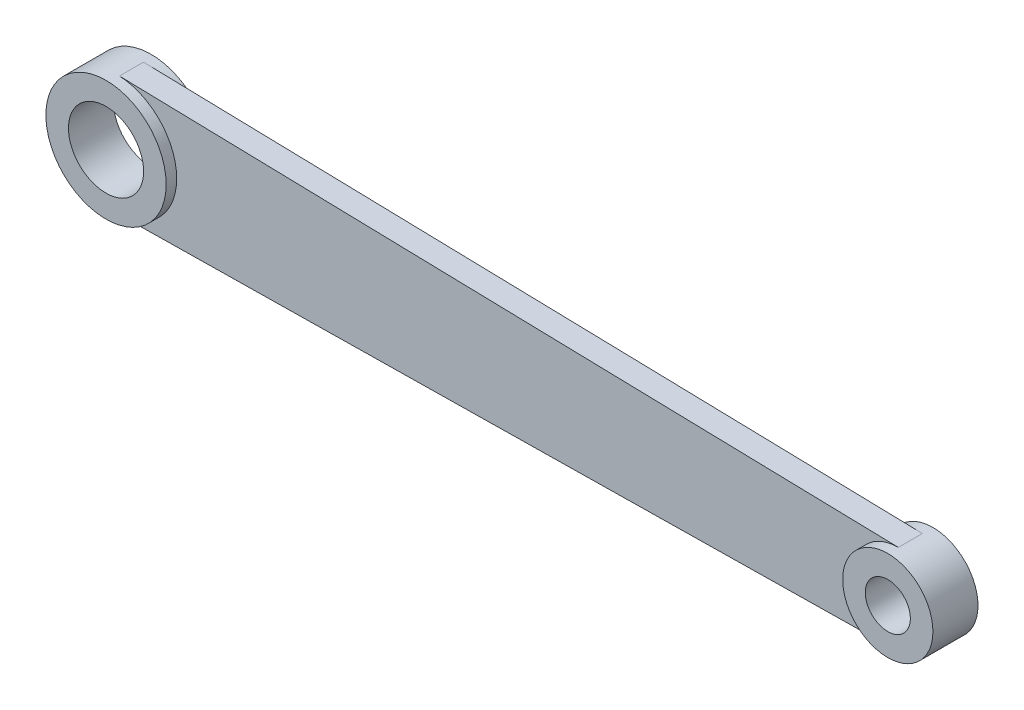
ISO-10303-21;
HEADER;
FILE_DESCRIPTION(('STEP AP214'),'2;1');
FILE_NAME('part.step','',(''),(''),'','','');
FILE_SCHEMA(('AUTOMOTIVE_DESIGN { 1 0 10303 214 1 1 1 1 }'));
ENDSEC;
DATA;
#1=APPLICATION_CONTEXT('core data for automotive mechanical design processes');
#2=APPLICATION_PROTOCOL_DEFINITION('international standard','automotive_design',2000,#1);
#3=PRODUCT_CONTEXT('',#1,'mechanical');
#4=PRODUCT('Part','Part','',(#3));
#5=PRODUCT_RELATED_PRODUCT_CATEGORY('part','',(#4));
#6=PRODUCT_DEFINITION_FORMATION('','',#4);
#7=PRODUCT_DEFINITION_CONTEXT('part definition',#1,'design');
#8=PRODUCT_DEFINITION('design','',#6,#7);
#9=PRODUCT_DEFINITION_SHAPE('','',#8);
#10=(LENGTH_UNIT() NAMED_UNIT(*) SI_UNIT(.MILLI.,.METRE.));
#11=(NAMED_UNIT(*) PLANE_ANGLE_UNIT() SI_UNIT($,.RADIAN.));
#12=(NAMED_UNIT(*) SI_UNIT($,.STERADIAN.) SOLID_ANGLE_UNIT());
#13=UNCERTAINTY_MEASURE_WITH_UNIT(LENGTH_MEASURE(1.E-05),#10,'distance_accuracy_value','');
#14=(GEOMETRIC_REPRESENTATION_CONTEXT(3) GLOBAL_UNCERTAINTY_ASSIGNED_CONTEXT((#13)) GLOBAL_UNIT_ASSIGNED_CONTEXT((#10,
#11,#12)) REPRESENTATION_CONTEXT('',''));
#15=CARTESIAN_POINT('',(0.,0.,0.));
#16=DIRECTION('',(0.,0.,1.));
#17=DIRECTION('',(1.,0.,0.));
#18=AXIS2_PLACEMENT_3D('',#15,#16,#17);
#19=CARTESIAN_POINT('',(0.365782486916927,15.1615884199877,4.));
#20=DIRECTION('',(0.0241185865450105,0.999709104581463,0.));
#21=DIRECTION('',(-0.999709104581463,0.0241185865450105,0.));
#22=AXIS2_PLACEMENT_3D('',#19,#20,#21);
#23=PLANE('',#22);
#24=DIRECTION('',(0.999709104581463,-0.0241185865450105,0.));
#25=VECTOR('',#24,1.);
#26=CARTESIAN_POINT('',(0.365782486916927,15.1615884199877,-4.));
#27=LINE('',#26,#25);
#28=CARTESIAN_POINT('',(-199.220649297423,19.9767317513228,-4.));
#29=VERTEX_POINT('',#28);
#30=CARTESIAN_POINT('',(59.8148878802298,13.7273428110589,-4.));
#31=VERTEX_POINT('',#30);
#32=EDGE_CURVE('E80',#29,#31,#27,.T.);
#33=ORIENTED_EDGE('',*,*,#32,.F.);
#34=DIRECTION('',(0.,0.,-1.));
#35=VECTOR('',#34,1.);
#36=CARTESIAN_POINT('',(-199.220649297423,19.9767317513228,4.));
#37=LINE('',#36,#35);
#38=CARTESIAN_POINT('',(-199.220649297423,19.9767317513228,4.));
#39=VERTEX_POINT('',#38);
#40=EDGE_CURVE('E43',#39,#29,#37,.T.);
#41=ORIENTED_EDGE('',*,*,#40,.F.);
#42=DIRECTION('',(0.999709104581463,-0.0241185865450105,0.));
#43=VECTOR('',#42,1.);
#44=CARTESIAN_POINT('',(0.365782486916927,15.1615884199877,4.));
#45=LINE('',#44,#43);
#46=CARTESIAN_POINT('',(59.8148878802297,13.7273428110589,4.));
#47=VERTEX_POINT('',#46);
#48=EDGE_CURVE('E87',#39,#47,#45,.T.);
#49=ORIENTED_EDGE('',*,*,#48,.T.);
#50=DIRECTION('',(0.,0.,-1.));
#51=VECTOR('',#50,1.);
#52=CARTESIAN_POINT('',(59.8148878802298,13.7273428110589,4.));
#53=LINE('',#52,#51);
#54=EDGE_CURVE('E11',#47,#31,#53,.T.);
#55=ORIENTED_EDGE('',*,*,#54,.T.);
#56=EDGE_LOOP('',(#33,#41,#49,#55));
#57=FACE_BOUND('',#56,.T.);
#58=ADVANCED_FACE('F36',(#57),#23,.T.);
#59=CARTESIAN_POINT('',(0.245526373288944,-17.1266396172959,4.));
#60=DIRECTION('',(-0.0143344609623184,0.99989725633633,0.));
#61=DIRECTION('',(-0.99989725633633,-0.0143344609623184,0.));
#62=AXIS2_PLACEMENT_3D('',#59,#60,#61);
#63=PLANE('',#62);
#64=DIRECTION('',(0.99989725633633,0.0143344609623184,0.));
#65=VECTOR('',#64,1.);
#66=CARTESIAN_POINT('',(0.245526373288944,-17.1266396172959,-4.));
#67=LINE('',#66,#65);
#68=CARTESIAN_POINT('',(-199.61179259228,-19.9917809291568,-4.));
#69=VERTEX_POINT('',#68);
#70=CARTESIAN_POINT('',(59.8148878802298,-16.2726571889411,-4.));
#71=VERTEX_POINT('',#70);
#72=EDGE_CURVE('E91',#69,#71,#67,.T.);
#73=ORIENTED_EDGE('',*,*,#72,.T.);
#74=DIRECTION('',(0.,0.,-1.));
#75=VECTOR('',#74,1.);
#76=CARTESIAN_POINT('',(59.8148878802298,-16.2726571889411,4.));
#77=LINE('',#76,#75);
#78=CARTESIAN_POINT('',(59.8148878802295,-16.2726571889411,4.));
#79=VERTEX_POINT('',#78);
#80=EDGE_CURVE('E50',#79,#71,#77,.T.);
#81=ORIENTED_EDGE('',*,*,#80,.F.);
#82=DIRECTION('',(0.99989725633633,0.0143344609623184,0.));
#83=VECTOR('',#82,1.);
#84=CARTESIAN_POINT('',(0.245526373288944,-17.1266396172959,4.));
#85=LINE('',#84,#83);
#86=CARTESIAN_POINT('',(-199.611792592279,-19.9917809291568,4.));
#87=VERTEX_POINT('',#86);
#88=EDGE_CURVE('E99',#87,#79,#85,.T.);
#89=ORIENTED_EDGE('',*,*,#88,.F.);
#90=DIRECTION('',(0.,0.,-1.));
#91=VECTOR('',#90,1.);
#92=CARTESIAN_POINT('',(-199.61179259228,-19.9917809291568,4.));
#93=LINE('',#92,#91);
#94=EDGE_CURVE('E98',#87,#69,#93,.T.);
#95=ORIENTED_EDGE('',*,*,#94,.T.);
#96=EDGE_LOOP('',(#73,#81,#89,#95));
#97=FACE_BOUND('',#96,.T.);
#98=ADVANCED_FACE('F103',(#97),#63,.F.);
#99=CARTESIAN_POINT('',(0.,0.,4.));
#100=DIRECTION('',(0.,0.,1.));
#101=DIRECTION('',(1.,0.,0.));
#102=AXIS2_PLACEMENT_3D('',#99,#100,#101);
#103=PLANE('',#102);
#104=CARTESIAN_POINT('',(59.8148878802298,-1.27265718894106,4.));
#105=DIRECTION('',(0.,0.,1.));
#106=DIRECTION('',(1.,0.,0.));
#107=AXIS2_PLACEMENT_3D('',#104,#105,#106);
#108=CIRCLE('',#107,15.);
#109=EDGE_CURVE('E96',#47,#79,#108,.T.);
#110=ORIENTED_EDGE('',*,*,#109,.F.);
#111=ORIENTED_EDGE('',*,*,#48,.F.);
#112=CARTESIAN_POINT('',(-200.18511211977,0.,4.));
#113=DIRECTION('',(0.,0.,1.));
#114=DIRECTION('',(1.,0.,0.));
#115=AXIS2_PLACEMENT_3D('',#112,#113,#114);
#116=CIRCLE('',#115,20.);
#117=EDGE_CURVE('E108',#87,#39,#116,.T.);
#118=ORIENTED_EDGE('',*,*,#117,.F.);
#119=ORIENTED_EDGE('',*,*,#88,.T.);
#120=EDGE_LOOP('',(#110,#111,#118,#119));
#121=FACE_BOUND('',#120,.T.);
#122=ADVANCED_FACE('F111',(#121),#103,.T.);
#123=CARTESIAN_POINT('',(0.,0.,-4.));
#124=DIRECTION('',(0.,0.,1.));
#125=DIRECTION('',(1.,0.,0.));
#126=AXIS2_PLACEMENT_3D('',#123,#124,#125);
#127=PLANE('',#126);
#128=CARTESIAN_POINT('',(59.8148878802298,-1.27265718894106,-4.));
#129=DIRECTION('',(0.,0.,1.));
#130=DIRECTION('',(1.,0.,0.));
#131=AXIS2_PLACEMENT_3D('',#128,#129,#130);
#132=CIRCLE('',#131,15.);
#133=EDGE_CURVE('E73',#31,#71,#132,.T.);
#134=ORIENTED_EDGE('',*,*,#133,.T.);
#135=ORIENTED_EDGE('',*,*,#72,.F.);
#136=CARTESIAN_POINT('',(-200.18511211977,0.,-4.));
#137=DIRECTION('',(0.,0.,1.));
#138=DIRECTION('',(1.,0.,0.));
#139=AXIS2_PLACEMENT_3D('',#136,#137,#138);
#140=CIRCLE('',#139,20.);
#141=EDGE_CURVE('E89',#69,#29,#140,.T.);
#142=ORIENTED_EDGE('',*,*,#141,.T.);
#143=ORIENTED_EDGE('',*,*,#32,.T.);
#144=EDGE_LOOP('',(#134,#135,#142,#143));
#145=FACE_BOUND('',#144,.T.);
#146=ADVANCED_FACE('F88',(#145),#127,.F.);
#147=CARTESIAN_POINT('',(-200.18511211977,0.,7.5));
#148=DIRECTION('',(0.,0.,1.));
#149=DIRECTION('',(1.,0.,0.));
#150=AXIS2_PLACEMENT_3D('',#147,#148,#149);
#151=PLANE('',#150);
#152=CARTESIAN_POINT('',(-200.18511211977,0.,7.5));
#153=DIRECTION('',(0.,0.,1.));
#154=DIRECTION('',(1.,0.,0.));
#155=AXIS2_PLACEMENT_3D('',#152,#153,#154);
#156=CIRCLE('',#155,20.);
#157=CARTESIAN_POINT('',(-180.18511211977,0.,7.5));
#158=VERTEX_POINT('',#157);
#159=EDGE_CURVE('E81',#158,#158,#156,.T.);
#160=ORIENTED_EDGE('',*,*,#159,.T.);
#161=EDGE_LOOP('',(#160));
#162=FACE_BOUND('',#161,.T.);
#163=CARTESIAN_POINT('',(-200.18511211977,0.,7.5));
#164=DIRECTION('',(0.,0.,1.));
#165=DIRECTION('',(1.,0.,0.));
#166=AXIS2_PLACEMENT_3D('',#163,#164,#165);
#167=CIRCLE('',#166,12.5);
#168=CARTESIAN_POINT('',(-187.68511211977,0.,7.5));
#169=VERTEX_POINT('',#168);
#170=EDGE_CURVE('E118',#169,#169,#167,.T.);
#171=ORIENTED_EDGE('',*,*,#170,.F.);
#172=EDGE_LOOP('',(#171));
#173=FACE_BOUND('',#172,.T.);
#174=ADVANCED_FACE('F167',(#162,#173),#151,.T.);
#175=CARTESIAN_POINT('',(-200.18511211977,0.,-7.5));
#176=DIRECTION('',(0.,0.,1.));
#177=DIRECTION('',(1.,0.,0.));
#178=AXIS2_PLACEMENT_3D('',#175,#176,#177);
#179=PLANE('',#178);
#180=CARTESIAN_POINT('',(-200.18511211977,0.,-7.5));
#181=DIRECTION('',(0.,0.,1.));
#182=DIRECTION('',(1.,0.,0.));
#183=AXIS2_PLACEMENT_3D('',#180,#181,#182);
#184=CIRCLE('',#183,20.);
#185=CARTESIAN_POINT('',(-180.18511211977,0.,-7.5));
#186=VERTEX_POINT('',#185);
#187=EDGE_CURVE('E115',#186,#186,#184,.T.);
#188=ORIENTED_EDGE('',*,*,#187,.F.);
#189=EDGE_LOOP('',(#188));
#190=FACE_BOUND('',#189,.T.);
#191=CARTESIAN_POINT('',(-200.18511211977,0.,-7.5));
#192=DIRECTION('',(0.,0.,1.));
#193=DIRECTION('',(1.,0.,0.));
#194=AXIS2_PLACEMENT_3D('',#191,#192,#193);
#195=CIRCLE('',#194,12.5);
#196=CARTESIAN_POINT('',(-187.68511211977,0.,-7.5));
#197=VERTEX_POINT('',#196);
#198=EDGE_CURVE('E121',#197,#197,#195,.T.);
#199=ORIENTED_EDGE('',*,*,#198,.T.);
#200=EDGE_LOOP('',(#199));
#201=FACE_BOUND('',#200,.T.);
#202=ADVANCED_FACE('F171',(#190,#201),#179,.F.);
#203=CARTESIAN_POINT('',(-200.18511211977,0.,7.5));
#204=DIRECTION('',(0.,0.,-1.));
#205=DIRECTION('',(-1.,0.,0.));
#206=AXIS2_PLACEMENT_3D('',#203,#204,#205);
#207=CYLINDRICAL_SURFACE('',#206,20.);
#208=ORIENTED_EDGE('',*,*,#117,.T.);
#209=ORIENTED_EDGE('',*,*,#40,.T.);
#210=ORIENTED_EDGE('',*,*,#141,.F.);
#211=ORIENTED_EDGE('',*,*,#94,.F.);
#212=EDGE_LOOP('',(#208,#209,#210,#211));
#213=FACE_BOUND('',#212,.T.);
#214=ORIENTED_EDGE('',*,*,#159,.F.);
#215=EDGE_LOOP('',(#214));
#216=FACE_BOUND('',#215,.T.);
#217=ORIENTED_EDGE('',*,*,#187,.T.);
#218=EDGE_LOOP('',(#217));
#219=FACE_BOUND('',#218,.T.);
#220=ADVANCED_FACE('F106',(#213,#216,#219),#207,.T.);
#221=CARTESIAN_POINT('',(-200.18511211977,0.,7.5));
#222=DIRECTION('',(0.,0.,-1.));
#223=DIRECTION('',(-1.,0.,0.));
#224=AXIS2_PLACEMENT_3D('',#221,#222,#223);
#225=CYLINDRICAL_SURFACE('',#224,12.5);
#226=ORIENTED_EDGE('',*,*,#170,.T.);
#227=EDGE_LOOP('',(#226));
#228=FACE_BOUND('',#227,.T.);
#229=ORIENTED_EDGE('',*,*,#198,.F.);
#230=EDGE_LOOP('',(#229));
#231=FACE_BOUND('',#230,.T.);
#232=ADVANCED_FACE('F145',(#228,#231),#225,.F.);
#233=CARTESIAN_POINT('',(59.8148878802298,-1.27265718894106,7.5));
#234=DIRECTION('',(0.,0.,1.));
#235=DIRECTION('',(1.,0.,0.));
#236=AXIS2_PLACEMENT_3D('',#233,#234,#235);
#237=PLANE('',#236);
#238=CARTESIAN_POINT('',(59.8148878802298,-1.27265718894106,7.5));
#239=DIRECTION('',(0.,0.,1.));
#240=DIRECTION('',(1.,0.,0.));
#241=AXIS2_PLACEMENT_3D('',#238,#239,#240);
#242=CIRCLE('',#241,15.);
#243=CARTESIAN_POINT('',(74.8148878802298,-1.27265718894106,7.5));
#244=VERTEX_POINT('',#243);
#245=EDGE_CURVE('E124',#244,#244,#242,.T.);
#246=ORIENTED_EDGE('',*,*,#245,.T.);
#247=EDGE_LOOP('',(#246));
#248=FACE_BOUND('',#247,.T.);
#249=CARTESIAN_POINT('',(59.8148878802298,-1.27265718894106,7.5));
#250=DIRECTION('',(0.,0.,1.));
#251=DIRECTION('',(1.,0.,0.));
#252=AXIS2_PLACEMENT_3D('',#249,#250,#251);
#253=CIRCLE('',#252,7.50000000000001);
#254=CARTESIAN_POINT('',(67.3148878802298,-1.27265718894106,7.5));
#255=VERTEX_POINT('',#254);
#256=EDGE_CURVE('E130',#255,#255,#253,.T.);
#257=ORIENTED_EDGE('',*,*,#256,.F.);
#258=EDGE_LOOP('',(#257));
#259=FACE_BOUND('',#258,.T.);
#260=ADVANCED_FACE('F142',(#248,#259),#237,.T.);
#261=CARTESIAN_POINT('',(59.8148878802298,-1.27265718894106,-7.5));
#262=DIRECTION('',(0.,0.,1.));
#263=DIRECTION('',(1.,0.,0.));
#264=AXIS2_PLACEMENT_3D('',#261,#262,#263);
#265=PLANE('',#264);
#266=CARTESIAN_POINT('',(59.8148878802298,-1.27265718894106,-7.5));
#267=DIRECTION('',(0.,0.,1.));
#268=DIRECTION('',(1.,0.,0.));
#269=AXIS2_PLACEMENT_3D('',#266,#267,#268);
#270=CIRCLE('',#269,15.);
#271=CARTESIAN_POINT('',(74.8148878802298,-1.27265718894106,-7.5));
#272=VERTEX_POINT('',#271);
#273=EDGE_CURVE('E127',#272,#272,#270,.T.);
#274=ORIENTED_EDGE('',*,*,#273,.F.);
#275=EDGE_LOOP('',(#274));
#276=FACE_BOUND('',#275,.T.);
#277=CARTESIAN_POINT('',(59.8148878802298,-1.27265718894106,-7.5));
#278=DIRECTION('',(0.,0.,1.));
#279=DIRECTION('',(1.,0.,0.));
#280=AXIS2_PLACEMENT_3D('',#277,#278,#279);
#281=CIRCLE('',#280,7.50000000000001);
#282=CARTESIAN_POINT('',(67.3148878802298,-1.27265718894106,-7.5));
#283=VERTEX_POINT('',#282);
#284=EDGE_CURVE('E133',#283,#283,#281,.T.);
#285=ORIENTED_EDGE('',*,*,#284,.T.);
#286=EDGE_LOOP('',(#285));
#287=FACE_BOUND('',#286,.T.);
#288=ADVANCED_FACE('F144',(#276,#287),#265,.F.);
#289=CARTESIAN_POINT('',(59.8148878802298,-1.27265718894106,7.5));
#290=DIRECTION('',(0.,0.,-1.));
#291=DIRECTION('',(-1.,0.,0.));
#292=AXIS2_PLACEMENT_3D('',#289,#290,#291);
#293=CYLINDRICAL_SURFACE('',#292,15.);
#294=ORIENTED_EDGE('',*,*,#109,.T.);
#295=ORIENTED_EDGE('',*,*,#80,.T.);
#296=ORIENTED_EDGE('',*,*,#133,.F.);
#297=ORIENTED_EDGE('',*,*,#54,.F.);
#298=EDGE_LOOP('',(#294,#295,#296,#297));
#299=FACE_BOUND('',#298,.T.);
#300=ORIENTED_EDGE('',*,*,#245,.F.);
#301=EDGE_LOOP('',(#300));
#302=FACE_BOUND('',#301,.T.);
#303=ORIENTED_EDGE('',*,*,#273,.T.);
#304=EDGE_LOOP('',(#303));
#305=FACE_BOUND('',#304,.T.);
#306=ADVANCED_FACE('F74',(#299,#302,#305),#293,.T.);
#307=CARTESIAN_POINT('',(59.8148878802298,-1.27265718894106,7.5));
#308=DIRECTION('',(0.,0.,-1.));
#309=DIRECTION('',(-1.,0.,0.));
#310=AXIS2_PLACEMENT_3D('',#307,#308,#309);
#311=CYLINDRICAL_SURFACE('',#310,7.50000000000001);
#312=ORIENTED_EDGE('',*,*,#256,.T.);
#313=EDGE_LOOP('',(#312));
#314=FACE_BOUND('',#313,.T.);
#315=ORIENTED_EDGE('',*,*,#284,.F.);
#316=EDGE_LOOP('',(#315));
#317=FACE_BOUND('',#316,.T.);
#318=ADVANCED_FACE('F139',(#314,#317),#311,.F.);
#319=CLOSED_SHELL('',(#58,#98,#122,#146,#174,#202,#220,#232,#260,#288,#306,#318));
#320=MANIFOLD_SOLID_BREP('B2',#319);
#321=ADVANCED_BREP_SHAPE_REPRESENTATION('',(#18,#320),#14);
#322=SHAPE_DEFINITION_REPRESENTATION(#9,#321);
ENDSEC;
END-ISO-10303-21;
